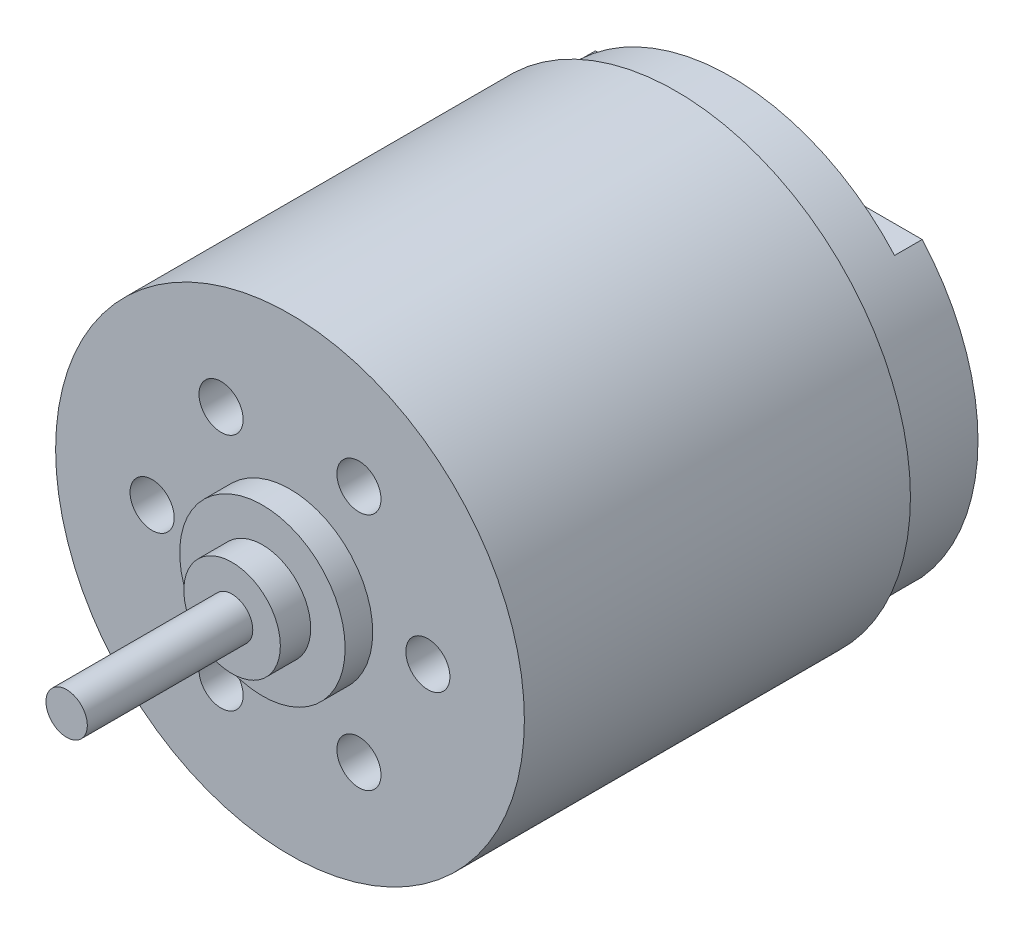
ISO-10303-21;
HEADER;
FILE_DESCRIPTION(('STEP AP214'),'2;1');
FILE_NAME('part.step','',(''),(''),'','','');
FILE_SCHEMA(('AUTOMOTIVE_DESIGN { 1 0 10303 214 1 1 1 1 }'));
ENDSEC;
DATA;
#1=APPLICATION_CONTEXT('core data for automotive mechanical design processes');
#2=APPLICATION_PROTOCOL_DEFINITION('international standard','automotive_design',2000,#1);
#3=PRODUCT_CONTEXT('',#1,'mechanical');
#4=PRODUCT('Part','Part','',(#3));
#5=PRODUCT_RELATED_PRODUCT_CATEGORY('part','',(#4));
#6=PRODUCT_DEFINITION_FORMATION('','',#4);
#7=PRODUCT_DEFINITION_CONTEXT('part definition',#1,'design');
#8=PRODUCT_DEFINITION('design','',#6,#7);
#9=PRODUCT_DEFINITION_SHAPE('','',#8);
#10=(LENGTH_UNIT() NAMED_UNIT(*) SI_UNIT(.MILLI.,.METRE.));
#11=(NAMED_UNIT(*) PLANE_ANGLE_UNIT() SI_UNIT($,.RADIAN.));
#12=(NAMED_UNIT(*) SI_UNIT($,.STERADIAN.) SOLID_ANGLE_UNIT());
#13=UNCERTAINTY_MEASURE_WITH_UNIT(LENGTH_MEASURE(1.E-05),#10,'distance_accuracy_value','');
#14=(GEOMETRIC_REPRESENTATION_CONTEXT(3) GLOBAL_UNCERTAINTY_ASSIGNED_CONTEXT((#13)) GLOBAL_UNIT_ASSIGNED_CONTEXT((#10,
#11,#12)) REPRESENTATION_CONTEXT('',''));
#15=CARTESIAN_POINT('',(0.,0.,0.));
#16=DIRECTION('',(0.,0.,1.));
#17=DIRECTION('',(1.,0.,0.));
#18=AXIS2_PLACEMENT_3D('',#15,#16,#17);
#19=CARTESIAN_POINT('',(0.,0.,637.54));
#20=DIRECTION('',(0.,0.,1.));
#21=DIRECTION('',(1.,0.,0.));
#22=AXIS2_PLACEMENT_3D('',#19,#20,#21);
#23=PLANE('',#22);
#24=CARTESIAN_POINT('',(0.,0.,637.54));
#25=DIRECTION('',(0.,0.,1.));
#26=DIRECTION('',(1.,0.,0.));
#27=AXIS2_PLACEMENT_3D('',#24,#25,#26);
#28=CIRCLE('',#27,19.05);
#29=CARTESIAN_POINT('',(19.05,0.,637.54));
#30=VERTEX_POINT('',#29);
#31=EDGE_CURVE('E19',#30,#30,#28,.F.);
#32=ORIENTED_EDGE('',*,*,#31,.F.);
#33=EDGE_LOOP('',(#32));
#34=FACE_BOUND('',#33,.T.);
#35=ADVANCED_FACE('F16',(#34),#23,.T.);
#36=CARTESIAN_POINT('',(0.,0.,485.14));
#37=DIRECTION('',(0.,0.,1.));
#38=DIRECTION('',(1.,0.,0.));
#39=AXIS2_PLACEMENT_3D('',#36,#37,#38);
#40=CYLINDRICAL_SURFACE('',#39,19.05);
#41=CARTESIAN_POINT('',(0.,0.,485.14));
#42=DIRECTION('',(0.,0.,1.));
#43=DIRECTION('',(1.,0.,0.));
#44=AXIS2_PLACEMENT_3D('',#41,#42,#43);
#45=CIRCLE('',#44,19.05);
#46=CARTESIAN_POINT('',(19.05,0.,485.14));
#47=VERTEX_POINT('',#46);
#48=EDGE_CURVE('E87',#47,#47,#45,.F.);
#49=ORIENTED_EDGE('',*,*,#48,.F.);
#50=EDGE_LOOP('',(#49));
#51=FACE_BOUND('',#50,.T.);
#52=ORIENTED_EDGE('',*,*,#31,.T.);
#53=EDGE_LOOP('',(#52));
#54=FACE_BOUND('',#53,.T.);
#55=ADVANCED_FACE('F94',(#51,#54),#40,.T.);
#56=CARTESIAN_POINT('',(0.,0.,485.14));
#57=DIRECTION('',(0.,0.,1.));
#58=DIRECTION('',(1.,0.,0.));
#59=AXIS2_PLACEMENT_3D('',#56,#57,#58);
#60=PLANE('',#59);
#61=ORIENTED_EDGE('',*,*,#48,.T.);
#62=EDGE_LOOP('',(#61));
#63=FACE_BOUND('',#62,.T.);
#64=CARTESIAN_POINT('',(0.,0.,485.14));
#65=DIRECTION('',(0.,0.,1.));
#66=DIRECTION('',(1.,0.,0.));
#67=AXIS2_PLACEMENT_3D('',#64,#65,#66);
#68=CIRCLE('',#67,44.45);
#69=CARTESIAN_POINT('',(44.45,0.,485.14));
#70=VERTEX_POINT('',#69);
#71=EDGE_CURVE('E62',#70,#70,#68,.F.);
#72=ORIENTED_EDGE('',*,*,#71,.F.);
#73=EDGE_LOOP('',(#72));
#74=FACE_BOUND('',#73,.T.);
#75=ADVANCED_FACE('F101',(#63,#74),#60,.T.);
#76=CARTESIAN_POINT('',(0.,0.,457.2));
#77=DIRECTION('',(0.,0.,1.));
#78=DIRECTION('',(1.,0.,0.));
#79=AXIS2_PLACEMENT_3D('',#76,#77,#78);
#80=CYLINDRICAL_SURFACE('',#79,44.45);
#81=CARTESIAN_POINT('',(0.,0.,457.2));
#82=DIRECTION('',(0.,0.,1.));
#83=DIRECTION('',(1.,0.,0.));
#84=AXIS2_PLACEMENT_3D('',#81,#82,#83);
#85=CIRCLE('',#84,44.45);
#86=CARTESIAN_POINT('',(44.45,0.,457.2));
#87=VERTEX_POINT('',#86);
#88=EDGE_CURVE('E79',#87,#87,#85,.F.);
#89=ORIENTED_EDGE('',*,*,#88,.F.);
#90=EDGE_LOOP('',(#89));
#91=FACE_BOUND('',#90,.T.);
#92=ORIENTED_EDGE('',*,*,#71,.T.);
#93=EDGE_LOOP('',(#92));
#94=FACE_BOUND('',#93,.T.);
#95=ADVANCED_FACE('F194',(#91,#94),#80,.T.);
#96=CARTESIAN_POINT('',(0.,-154.940209157209,25.4));
#97=DIRECTION('',(0.,0.,1.));
#98=DIRECTION('',(1.,0.,0.));
#99=AXIS2_PLACEMENT_3D('',#96,#97,#98);
#100=PLANE('',#99);
#101=CARTESIAN_POINT('',(0.,0.,25.4));
#102=DIRECTION('',(0.,0.,1.));
#103=DIRECTION('',(1.,0.,0.));
#104=AXIS2_PLACEMENT_3D('',#101,#102,#103);
#105=CIRCLE('',#104,201.93);
#106=CARTESIAN_POINT('',(-150.509735565511,-134.62,25.4));
#107=VERTEX_POINT('',#106);
#108=CARTESIAN_POINT('',(150.509735565511,-134.62,25.4));
#109=VERTEX_POINT('',#108);
#110=EDGE_CURVE('E57',#107,#109,#105,.T.);
#111=ORIENTED_EDGE('',*,*,#110,.F.);
#112=DIRECTION('',(1.,0.,0.));
#113=VECTOR('',#112,1.);
#114=CARTESIAN_POINT('',(150.509735565511,-134.62,25.4));
#115=LINE('',#114,#113);
#116=EDGE_CURVE('E53',#107,#109,#115,.T.);
#117=ORIENTED_EDGE('',*,*,#116,.T.);
#118=EDGE_LOOP('',(#111,#117));
#119=FACE_BOUND('',#118,.T.);
#120=ADVANCED_FACE('F55',(#119),#100,.F.);
#121=CARTESIAN_POINT('',(150.509735565511,-134.62,0.));
#122=DIRECTION('',(0.,1.,0.));
#123=DIRECTION('',(0.,0.,1.));
#124=AXIS2_PLACEMENT_3D('',#121,#122,#123);
#125=PLANE('',#124);
#126=DIRECTION('',(0.,0.,1.));
#127=VECTOR('',#126,1.);
#128=CARTESIAN_POINT('',(150.509735565511,-134.62,0.));
#129=LINE('',#128,#127);
#130=CARTESIAN_POINT('',(150.509735565511,-134.62,0.));
#131=VERTEX_POINT('',#130);
#132=EDGE_CURVE('E66',#109,#131,#129,.F.);
#133=ORIENTED_EDGE('',*,*,#132,.F.);
#134=ORIENTED_EDGE('',*,*,#116,.F.);
#135=DIRECTION('',(0.,0.,1.));
#136=VECTOR('',#135,1.);
#137=CARTESIAN_POINT('',(-150.509735565511,-134.62,0.));
#138=LINE('',#137,#136);
#139=CARTESIAN_POINT('',(-150.509735565511,-134.62,0.));
#140=VERTEX_POINT('',#139);
#141=EDGE_CURVE('E77',#140,#107,#138,.T.);
#142=ORIENTED_EDGE('',*,*,#141,.F.);
#143=DIRECTION('',(1.,0.,0.));
#144=VECTOR('',#143,1.);
#145=CARTESIAN_POINT('',(0.,-134.62,0.));
#146=LINE('',#145,#144);
#147=EDGE_CURVE('E69',#140,#131,#146,.T.);
#148=ORIENTED_EDGE('',*,*,#147,.T.);
#149=EDGE_LOOP('',(#133,#134,#142,#148));
#150=FACE_BOUND('',#149,.T.);
#151=ADVANCED_FACE('F67',(#150),#125,.F.);
#152=CARTESIAN_POINT('',(0.,154.940209157209,25.4));
#153=DIRECTION('',(0.,0.,1.));
#154=DIRECTION('',(1.,0.,0.));
#155=AXIS2_PLACEMENT_3D('',#152,#153,#154);
#156=PLANE('',#155);
#157=CARTESIAN_POINT('',(0.,0.,25.4));
#158=DIRECTION('',(0.,0.,1.));
#159=DIRECTION('',(1.,0.,0.));
#160=AXIS2_PLACEMENT_3D('',#157,#158,#159);
#161=CIRCLE('',#160,201.93);
#162=CARTESIAN_POINT('',(150.509735565511,134.62,25.4));
#163=VERTEX_POINT('',#162);
#164=CARTESIAN_POINT('',(-150.509735565511,134.62,25.4));
#165=VERTEX_POINT('',#164);
#166=EDGE_CURVE('E381',#163,#165,#161,.T.);
#167=ORIENTED_EDGE('',*,*,#166,.F.);
#168=DIRECTION('',(1.,0.,0.));
#169=VECTOR('',#168,1.);
#170=CARTESIAN_POINT('',(0.,134.62,25.4));
#171=LINE('',#170,#169);
#172=EDGE_CURVE('E61',#163,#165,#171,.F.);
#173=ORIENTED_EDGE('',*,*,#172,.T.);
#174=EDGE_LOOP('',(#167,#173));
#175=FACE_BOUND('',#174,.T.);
#176=ADVANCED_FACE('F186',(#175),#156,.F.);
#177=CARTESIAN_POINT('',(0.,134.62,0.));
#178=DIRECTION('',(0.,-1.,0.));
#179=DIRECTION('',(1.,0.,0.));
#180=AXIS2_PLACEMENT_3D('',#177,#178,#179);
#181=PLANE('',#180);
#182=DIRECTION('',(0.,0.,1.));
#183=VECTOR('',#182,1.);
#184=CARTESIAN_POINT('',(-150.509735565511,134.62,0.));
#185=LINE('',#184,#183);
#186=CARTESIAN_POINT('',(-150.509735565511,134.62,0.));
#187=VERTEX_POINT('',#186);
#188=EDGE_CURVE('E378',#165,#187,#185,.F.);
#189=ORIENTED_EDGE('',*,*,#188,.F.);
#190=ORIENTED_EDGE('',*,*,#172,.F.);
#191=DIRECTION('',(0.,0.,1.));
#192=VECTOR('',#191,1.);
#193=CARTESIAN_POINT('',(150.509735565511,134.62,0.));
#194=LINE('',#193,#192);
#195=CARTESIAN_POINT('',(150.509735565511,134.62,0.));
#196=VERTEX_POINT('',#195);
#197=EDGE_CURVE('E383',#196,#163,#194,.T.);
#198=ORIENTED_EDGE('',*,*,#197,.F.);
#199=DIRECTION('',(1.,0.,0.));
#200=VECTOR('',#199,1.);
#201=CARTESIAN_POINT('',(0.,134.62,0.));
#202=LINE('',#201,#200);
#203=EDGE_CURVE('E34',#196,#187,#202,.F.);
#204=ORIENTED_EDGE('',*,*,#203,.T.);
#205=EDGE_LOOP('',(#189,#190,#198,#204));
#206=FACE_BOUND('',#205,.T.);
#207=ADVANCED_FACE('F182',(#206),#181,.F.);
#208=CARTESIAN_POINT('',(0.,0.,0.));
#209=DIRECTION('',(0.,0.,1.));
#210=DIRECTION('',(1.,0.,0.));
#211=AXIS2_PLACEMENT_3D('',#208,#209,#210);
#212=PLANE('',#211);
#213=ORIENTED_EDGE('',*,*,#147,.F.);
#214=CARTESIAN_POINT('',(0.,0.,0.));
#215=DIRECTION('',(0.,0.,1.));
#216=DIRECTION('',(1.,0.,0.));
#217=AXIS2_PLACEMENT_3D('',#214,#215,#216);
#218=CIRCLE('',#217,201.93);
#219=EDGE_CURVE('E373',#187,#140,#218,.T.);
#220=ORIENTED_EDGE('',*,*,#219,.F.);
#221=ORIENTED_EDGE('',*,*,#203,.F.);
#222=CARTESIAN_POINT('',(0.,0.,0.));
#223=DIRECTION('',(0.,0.,1.));
#224=DIRECTION('',(1.,0.,0.));
#225=AXIS2_PLACEMENT_3D('',#222,#223,#224);
#226=CIRCLE('',#225,201.93);
#227=EDGE_CURVE('E72',#131,#196,#226,.T.);
#228=ORIENTED_EDGE('',*,*,#227,.F.);
#229=EDGE_LOOP('',(#213,#220,#221,#228));
#230=FACE_BOUND('',#229,.T.);
#231=ADVANCED_FACE('F178',(#230),#212,.F.);
#232=CARTESIAN_POINT('',(0.,0.,457.2));
#233=DIRECTION('',(0.,0.,1.));
#234=DIRECTION('',(1.,0.,0.));
#235=AXIS2_PLACEMENT_3D('',#232,#233,#234);
#236=PLANE('',#235);
#237=ORIENTED_EDGE('',*,*,#88,.T.);
#238=EDGE_LOOP('',(#237));
#239=FACE_BOUND('',#238,.T.);
#240=CARTESIAN_POINT('',(0.,0.,457.2));
#241=DIRECTION('',(0.,0.,1.));
#242=DIRECTION('',(1.,0.,0.));
#243=AXIS2_PLACEMENT_3D('',#240,#241,#242);
#244=CIRCLE('',#243,76.2);
#245=CARTESIAN_POINT('',(76.2,0.,457.2));
#246=VERTEX_POINT('',#245);
#247=EDGE_CURVE('E371',#246,#246,#244,.F.);
#248=ORIENTED_EDGE('',*,*,#247,.F.);
#249=EDGE_LOOP('',(#248));
#250=FACE_BOUND('',#249,.T.);
#251=ADVANCED_FACE('F174',(#239,#250),#236,.T.);
#252=CARTESIAN_POINT('',(-63.5000000000001,-109.985226280624,391.16));
#253=DIRECTION('',(0.,0.,1.));
#254=DIRECTION('',(1.,0.,0.));
#255=AXIS2_PLACEMENT_3D('',#252,#253,#254);
#256=PLANE('',#255);
#257=CARTESIAN_POINT('',(-63.5,-109.985226280624,391.16));
#258=DIRECTION('',(0.,0.,-1.));
#259=DIRECTION('',(-1.,0.,0.));
#260=AXIS2_PLACEMENT_3D('',#257,#258,#259);
#261=CIRCLE('',#260,20.32);
#262=CARTESIAN_POINT('',(-83.8200000000001,-109.985226280624,391.16));
#263=VERTEX_POINT('',#262);
#264=EDGE_CURVE('E372',#263,#263,#261,.F.);
#265=ORIENTED_EDGE('',*,*,#264,.T.);
#266=EDGE_LOOP('',(#265));
#267=FACE_BOUND('',#266,.T.);
#268=ADVANCED_FACE('F170',(#267),#256,.T.);
#269=CARTESIAN_POINT('',(-63.4999999999999,109.985226280624,391.16));
#270=DIRECTION('',(0.,0.,1.));
#271=DIRECTION('',(1.,0.,0.));
#272=AXIS2_PLACEMENT_3D('',#269,#270,#271);
#273=PLANE('',#272);
#274=CARTESIAN_POINT('',(-63.4999999999999,109.985226280624,391.16));
#275=DIRECTION('',(0.,0.,-1.));
#276=DIRECTION('',(-1.,0.,0.));
#277=AXIS2_PLACEMENT_3D('',#274,#275,#276);
#278=CIRCLE('',#277,20.32);
#279=CARTESIAN_POINT('',(-83.8199999999999,109.985226280624,391.16));
#280=VERTEX_POINT('',#279);
#281=EDGE_CURVE('E376',#280,#280,#278,.F.);
#282=ORIENTED_EDGE('',*,*,#281,.T.);
#283=EDGE_LOOP('',(#282));
#284=FACE_BOUND('',#283,.T.);
#285=ADVANCED_FACE('F166',(#284),#273,.T.);
#286=CARTESIAN_POINT('',(127.,0.,391.16));
#287=DIRECTION('',(0.,0.,1.));
#288=DIRECTION('',(1.,0.,0.));
#289=AXIS2_PLACEMENT_3D('',#286,#287,#288);
#290=PLANE('',#289);
#291=CARTESIAN_POINT('',(127.,0.,391.16));
#292=DIRECTION('',(0.,0.,-1.));
#293=DIRECTION('',(-1.,0.,0.));
#294=AXIS2_PLACEMENT_3D('',#291,#292,#293);
#295=CIRCLE('',#294,20.32);
#296=CARTESIAN_POINT('',(106.68,0.,391.16));
#297=VERTEX_POINT('',#296);
#298=EDGE_CURVE('E424',#297,#297,#295,.F.);
#299=ORIENTED_EDGE('',*,*,#298,.T.);
#300=EDGE_LOOP('',(#299));
#301=FACE_BOUND('',#300,.T.);
#302=ADVANCED_FACE('F162',(#301),#290,.T.);
#303=CARTESIAN_POINT('',(63.5000000000001,109.985226280624,391.16));
#304=DIRECTION('',(0.,0.,1.));
#305=DIRECTION('',(1.,0.,0.));
#306=AXIS2_PLACEMENT_3D('',#303,#304,#305);
#307=PLANE('',#306);
#308=CARTESIAN_POINT('',(63.5,109.985226280624,391.16));
#309=DIRECTION('',(0.,0.,-1.));
#310=DIRECTION('',(-1.,0.,0.));
#311=AXIS2_PLACEMENT_3D('',#308,#309,#310);
#312=CIRCLE('',#311,20.32);
#313=CARTESIAN_POINT('',(43.18,109.985226280624,391.16));
#314=VERTEX_POINT('',#313);
#315=EDGE_CURVE('E421',#314,#314,#312,.F.);
#316=ORIENTED_EDGE('',*,*,#315,.T.);
#317=EDGE_LOOP('',(#316));
#318=FACE_BOUND('',#317,.T.);
#319=ADVANCED_FACE('F158',(#318),#307,.T.);
#320=CARTESIAN_POINT('',(-127.,0.,391.16));
#321=DIRECTION('',(0.,0.,1.));
#322=DIRECTION('',(1.,0.,0.));
#323=AXIS2_PLACEMENT_3D('',#320,#321,#322);
#324=PLANE('',#323);
#325=CARTESIAN_POINT('',(-127.,0.,391.16));
#326=DIRECTION('',(0.,0.,-1.));
#327=DIRECTION('',(-1.,0.,0.));
#328=AXIS2_PLACEMENT_3D('',#325,#326,#327);
#329=CIRCLE('',#328,20.32);
#330=CARTESIAN_POINT('',(-147.32,0.,391.16));
#331=VERTEX_POINT('',#330);
#332=EDGE_CURVE('E418',#331,#331,#329,.F.);
#333=ORIENTED_EDGE('',*,*,#332,.T.);
#334=EDGE_LOOP('',(#333));
#335=FACE_BOUND('',#334,.T.);
#336=ADVANCED_FACE('F154',(#335),#324,.T.);
#337=CARTESIAN_POINT('',(63.4999999999999,-109.985226280624,391.16));
#338=DIRECTION('',(0.,0.,1.));
#339=DIRECTION('',(1.,0.,0.));
#340=AXIS2_PLACEMENT_3D('',#337,#338,#339);
#341=PLANE('',#340);
#342=CARTESIAN_POINT('',(63.4999999999999,-109.985226280624,391.16));
#343=DIRECTION('',(0.,0.,-1.));
#344=DIRECTION('',(-1.,0.,0.));
#345=AXIS2_PLACEMENT_3D('',#342,#343,#344);
#346=CIRCLE('',#345,20.32);
#347=CARTESIAN_POINT('',(43.1799999999999,-109.985226280624,391.16));
#348=VERTEX_POINT('',#347);
#349=EDGE_CURVE('E415',#348,#348,#346,.F.);
#350=ORIENTED_EDGE('',*,*,#349,.T.);
#351=EDGE_LOOP('',(#350));
#352=FACE_BOUND('',#351,.T.);
#353=ADVANCED_FACE('F150',(#352),#341,.T.);
#354=CARTESIAN_POINT('',(0.,0.,0.));
#355=DIRECTION('',(0.,0.,1.));
#356=DIRECTION('',(1.,0.,0.));
#357=AXIS2_PLACEMENT_3D('',#354,#355,#356);
#358=CYLINDRICAL_SURFACE('',#357,201.93);
#359=CARTESIAN_POINT('',(0.,0.,76.2));
#360=DIRECTION('',(0.,0.,1.));
#361=DIRECTION('',(1.,0.,0.));
#362=AXIS2_PLACEMENT_3D('',#359,#360,#361);
#363=CIRCLE('',#362,201.93);
#364=CARTESIAN_POINT('',(201.93,0.,76.2));
#365=VERTEX_POINT('',#364);
#366=EDGE_CURVE('E412',#365,#365,#363,.F.);
#367=ORIENTED_EDGE('',*,*,#366,.T.);
#368=EDGE_LOOP('',(#367));
#369=FACE_BOUND('',#368,.T.);
#370=ORIENTED_EDGE('',*,*,#188,.T.);
#371=ORIENTED_EDGE('',*,*,#219,.T.);
#372=ORIENTED_EDGE('',*,*,#141,.T.);
#373=ORIENTED_EDGE('',*,*,#110,.T.);
#374=ORIENTED_EDGE('',*,*,#132,.T.);
#375=ORIENTED_EDGE('',*,*,#227,.T.);
#376=ORIENTED_EDGE('',*,*,#197,.T.);
#377=ORIENTED_EDGE('',*,*,#166,.T.);
#378=EDGE_LOOP('',(#370,#371,#372,#373,#374,#375,#376,#377));
#379=FACE_BOUND('',#378,.T.);
#380=ADVANCED_FACE('F75',(#369,#379),#358,.T.);
#381=CARTESIAN_POINT('',(0.,0.,431.8));
#382=DIRECTION('',(0.,0.,1.));
#383=DIRECTION('',(1.,0.,0.));
#384=AXIS2_PLACEMENT_3D('',#381,#382,#383);
#385=CYLINDRICAL_SURFACE('',#384,76.2);
#386=ORIENTED_EDGE('',*,*,#247,.T.);
#387=EDGE_LOOP('',(#386));
#388=FACE_BOUND('',#387,.T.);
#389=CARTESIAN_POINT('',(0.,0.,431.8));
#390=DIRECTION('',(0.,0.,1.));
#391=DIRECTION('',(1.,0.,0.));
#392=AXIS2_PLACEMENT_3D('',#389,#390,#391);
#393=CIRCLE('',#392,76.2);
#394=CARTESIAN_POINT('',(76.2,0.,431.8));
#395=VERTEX_POINT('',#394);
#396=EDGE_CURVE('E409',#395,#395,#393,.F.);
#397=ORIENTED_EDGE('',*,*,#396,.F.);
#398=EDGE_LOOP('',(#397));
#399=FACE_BOUND('',#398,.T.);
#400=ADVANCED_FACE('F143',(#388,#399),#385,.T.);
#401=CARTESIAN_POINT('',(-63.5,-109.985226280624,431.8));
#402=DIRECTION('',(0.,0.,-1.));
#403=DIRECTION('',(-1.,0.,0.));
#404=AXIS2_PLACEMENT_3D('',#401,#402,#403);
#405=CYLINDRICAL_SURFACE('',#404,20.32);
#406=ORIENTED_EDGE('',*,*,#264,.F.);
#407=EDGE_LOOP('',(#406));
#408=FACE_BOUND('',#407,.T.);
#409=CARTESIAN_POINT('',(-63.5,-109.985226280624,431.8));
#410=DIRECTION('',(0.,0.,-1.));
#411=DIRECTION('',(-1.,0.,0.));
#412=AXIS2_PLACEMENT_3D('',#409,#410,#411);
#413=CIRCLE('',#412,20.32);
#414=CARTESIAN_POINT('',(-83.8200000000001,-109.985226280624,431.8));
#415=VERTEX_POINT('',#414);
#416=EDGE_CURVE('E406',#415,#415,#413,.T.);
#417=ORIENTED_EDGE('',*,*,#416,.F.);
#418=EDGE_LOOP('',(#417));
#419=FACE_BOUND('',#418,.T.);
#420=ADVANCED_FACE('F139',(#408,#419),#405,.F.);
#421=CARTESIAN_POINT('',(-63.4999999999999,109.985226280624,431.8));
#422=DIRECTION('',(0.,0.,-1.));
#423=DIRECTION('',(-1.,0.,0.));
#424=AXIS2_PLACEMENT_3D('',#421,#422,#423);
#425=CYLINDRICAL_SURFACE('',#424,20.32);
#426=ORIENTED_EDGE('',*,*,#281,.F.);
#427=EDGE_LOOP('',(#426));
#428=FACE_BOUND('',#427,.T.);
#429=CARTESIAN_POINT('',(-63.4999999999999,109.985226280624,431.8));
#430=DIRECTION('',(0.,0.,-1.));
#431=DIRECTION('',(-1.,0.,0.));
#432=AXIS2_PLACEMENT_3D('',#429,#430,#431);
#433=CIRCLE('',#432,20.32);
#434=CARTESIAN_POINT('',(-83.8199999999999,109.985226280624,431.8));
#435=VERTEX_POINT('',#434);
#436=EDGE_CURVE('E403',#435,#435,#433,.T.);
#437=ORIENTED_EDGE('',*,*,#436,.F.);
#438=EDGE_LOOP('',(#437));
#439=FACE_BOUND('',#438,.T.);
#440=ADVANCED_FACE('F135',(#428,#439),#425,.F.);
#441=CARTESIAN_POINT('',(127.,0.,431.8));
#442=DIRECTION('',(0.,0.,-1.));
#443=DIRECTION('',(-1.,0.,0.));
#444=AXIS2_PLACEMENT_3D('',#441,#442,#443);
#445=CYLINDRICAL_SURFACE('',#444,20.32);
#446=ORIENTED_EDGE('',*,*,#298,.F.);
#447=EDGE_LOOP('',(#446));
#448=FACE_BOUND('',#447,.T.);
#449=CARTESIAN_POINT('',(127.,0.,431.8));
#450=DIRECTION('',(0.,0.,-1.));
#451=DIRECTION('',(-1.,0.,0.));
#452=AXIS2_PLACEMENT_3D('',#449,#450,#451);
#453=CIRCLE('',#452,20.32);
#454=CARTESIAN_POINT('',(106.68,0.,431.8));
#455=VERTEX_POINT('',#454);
#456=EDGE_CURVE('E400',#455,#455,#453,.T.);
#457=ORIENTED_EDGE('',*,*,#456,.F.);
#458=EDGE_LOOP('',(#457));
#459=FACE_BOUND('',#458,.T.);
#460=ADVANCED_FACE('F131',(#448,#459),#445,.F.);
#461=CARTESIAN_POINT('',(63.5,109.985226280624,431.8));
#462=DIRECTION('',(0.,0.,-1.));
#463=DIRECTION('',(-1.,0.,0.));
#464=AXIS2_PLACEMENT_3D('',#461,#462,#463);
#465=CYLINDRICAL_SURFACE('',#464,20.32);
#466=ORIENTED_EDGE('',*,*,#315,.F.);
#467=EDGE_LOOP('',(#466));
#468=FACE_BOUND('',#467,.T.);
#469=CARTESIAN_POINT('',(63.5,109.985226280624,431.8));
#470=DIRECTION('',(0.,0.,-1.));
#471=DIRECTION('',(-1.,0.,0.));
#472=AXIS2_PLACEMENT_3D('',#469,#470,#471);
#473=CIRCLE('',#472,20.32);
#474=CARTESIAN_POINT('',(43.18,109.985226280624,431.8));
#475=VERTEX_POINT('',#474);
#476=EDGE_CURVE('E397',#475,#475,#473,.T.);
#477=ORIENTED_EDGE('',*,*,#476,.F.);
#478=EDGE_LOOP('',(#477));
#479=FACE_BOUND('',#478,.T.);
#480=ADVANCED_FACE('F127',(#468,#479),#465,.F.);
#481=CARTESIAN_POINT('',(-127.,0.,431.8));
#482=DIRECTION('',(0.,0.,-1.));
#483=DIRECTION('',(-1.,0.,0.));
#484=AXIS2_PLACEMENT_3D('',#481,#482,#483);
#485=CYLINDRICAL_SURFACE('',#484,20.32);
#486=ORIENTED_EDGE('',*,*,#332,.F.);
#487=EDGE_LOOP('',(#486));
#488=FACE_BOUND('',#487,.T.);
#489=CARTESIAN_POINT('',(-127.,0.,431.8));
#490=DIRECTION('',(0.,0.,-1.));
#491=DIRECTION('',(-1.,0.,0.));
#492=AXIS2_PLACEMENT_3D('',#489,#490,#491);
#493=CIRCLE('',#492,20.32);
#494=CARTESIAN_POINT('',(-147.32,0.,431.8));
#495=VERTEX_POINT('',#494);
#496=EDGE_CURVE('E394',#495,#495,#493,.T.);
#497=ORIENTED_EDGE('',*,*,#496,.F.);
#498=EDGE_LOOP('',(#497));
#499=FACE_BOUND('',#498,.T.);
#500=ADVANCED_FACE('F123',(#488,#499),#485,.F.);
#501=CARTESIAN_POINT('',(63.4999999999999,-109.985226280624,431.8));
#502=DIRECTION('',(0.,0.,-1.));
#503=DIRECTION('',(-1.,0.,0.));
#504=AXIS2_PLACEMENT_3D('',#501,#502,#503);
#505=CYLINDRICAL_SURFACE('',#504,20.32);
#506=ORIENTED_EDGE('',*,*,#349,.F.);
#507=EDGE_LOOP('',(#506));
#508=FACE_BOUND('',#507,.T.);
#509=CARTESIAN_POINT('',(63.4999999999999,-109.985226280624,431.8));
#510=DIRECTION('',(0.,0.,-1.));
#511=DIRECTION('',(-1.,0.,0.));
#512=AXIS2_PLACEMENT_3D('',#509,#510,#511);
#513=CIRCLE('',#512,20.32);
#514=CARTESIAN_POINT('',(43.1799999999999,-109.985226280624,431.8));
#515=VERTEX_POINT('',#514);
#516=EDGE_CURVE('E391',#515,#515,#513,.T.);
#517=ORIENTED_EDGE('',*,*,#516,.F.);
#518=EDGE_LOOP('',(#517));
#519=FACE_BOUND('',#518,.T.);
#520=ADVANCED_FACE('F119',(#508,#519),#505,.F.);
#521=CARTESIAN_POINT('',(0.,0.,76.2));
#522=DIRECTION('',(0.,0.,1.));
#523=DIRECTION('',(1.,0.,0.));
#524=AXIS2_PLACEMENT_3D('',#521,#522,#523);
#525=PLANE('',#524);
#526=CARTESIAN_POINT('',(0.,0.,76.2));
#527=DIRECTION('',(0.,0.,1.));
#528=DIRECTION('',(1.,0.,0.));
#529=AXIS2_PLACEMENT_3D('',#526,#527,#528);
#530=CIRCLE('',#529,215.9);
#531=CARTESIAN_POINT('',(215.9,0.,76.2));
#532=VERTEX_POINT('',#531);
#533=EDGE_CURVE('E25',#532,#532,#530,.T.);
#534=ORIENTED_EDGE('',*,*,#533,.F.);
#535=EDGE_LOOP('',(#534));
#536=FACE_BOUND('',#535,.T.);
#537=ORIENTED_EDGE('',*,*,#366,.F.);
#538=EDGE_LOOP('',(#537));
#539=FACE_BOUND('',#538,.T.);
#540=ADVANCED_FACE('F111',(#536,#539),#525,.F.);
#541=CARTESIAN_POINT('',(0.,0.,431.8));
#542=DIRECTION('',(0.,0.,1.));
#543=DIRECTION('',(1.,0.,0.));
#544=AXIS2_PLACEMENT_3D('',#541,#542,#543);
#545=PLANE('',#544);
#546=CARTESIAN_POINT('',(0.,0.,431.8));
#547=DIRECTION('',(0.,0.,1.));
#548=DIRECTION('',(1.,0.,0.));
#549=AXIS2_PLACEMENT_3D('',#546,#547,#548);
#550=CIRCLE('',#549,215.9);
#551=CARTESIAN_POINT('',(215.9,0.,431.8));
#552=VERTEX_POINT('',#551);
#553=EDGE_CURVE('E10',#552,#552,#550,.F.);
#554=ORIENTED_EDGE('',*,*,#553,.F.);
#555=EDGE_LOOP('',(#554));
#556=FACE_BOUND('',#555,.T.);
#557=ORIENTED_EDGE('',*,*,#516,.T.);
#558=EDGE_LOOP('',(#557));
#559=FACE_BOUND('',#558,.T.);
#560=ORIENTED_EDGE('',*,*,#496,.T.);
#561=EDGE_LOOP('',(#560));
#562=FACE_BOUND('',#561,.T.);
#563=ORIENTED_EDGE('',*,*,#476,.T.);
#564=EDGE_LOOP('',(#563));
#565=FACE_BOUND('',#564,.T.);
#566=ORIENTED_EDGE('',*,*,#456,.T.);
#567=EDGE_LOOP('',(#566));
#568=FACE_BOUND('',#567,.T.);
#569=ORIENTED_EDGE('',*,*,#436,.T.);
#570=EDGE_LOOP('',(#569));
#571=FACE_BOUND('',#570,.T.);
#572=ORIENTED_EDGE('',*,*,#416,.T.);
#573=EDGE_LOOP('',(#572));
#574=FACE_BOUND('',#573,.T.);
#575=ORIENTED_EDGE('',*,*,#396,.T.);
#576=EDGE_LOOP('',(#575));
#577=FACE_BOUND('',#576,.T.);
#578=ADVANCED_FACE('F105',(#556,#559,#562,#565,#568,#571,#574,#577),#545,.T.);
#579=CARTESIAN_POINT('',(0.,0.,76.2));
#580=DIRECTION('',(0.,0.,1.));
#581=DIRECTION('',(1.,0.,0.));
#582=AXIS2_PLACEMENT_3D('',#579,#580,#581);
#583=CYLINDRICAL_SURFACE('',#582,215.9);
#584=ORIENTED_EDGE('',*,*,#533,.T.);
#585=EDGE_LOOP('',(#584));
#586=FACE_BOUND('',#585,.T.);
#587=ORIENTED_EDGE('',*,*,#553,.T.);
#588=EDGE_LOOP('',(#587));
#589=FACE_BOUND('',#588,.T.);
#590=ADVANCED_FACE('F103',(#586,#589),#583,.T.);
#591=CLOSED_SHELL('',(#35,#55,#75,#95,#120,#151,#176,#207,#231,#251,#268,#285,#302,#319,#336,
#353,#380,#400,#420,#440,#460,#480,#500,#520,#540,#578,#590));
#592=MANIFOLD_SOLID_BREP('B1',#591);
#593=ADVANCED_BREP_SHAPE_REPRESENTATION('',(#18,#592),#14);
#594=SHAPE_DEFINITION_REPRESENTATION(#9,#593);
ENDSEC;
END-ISO-10303-21;
